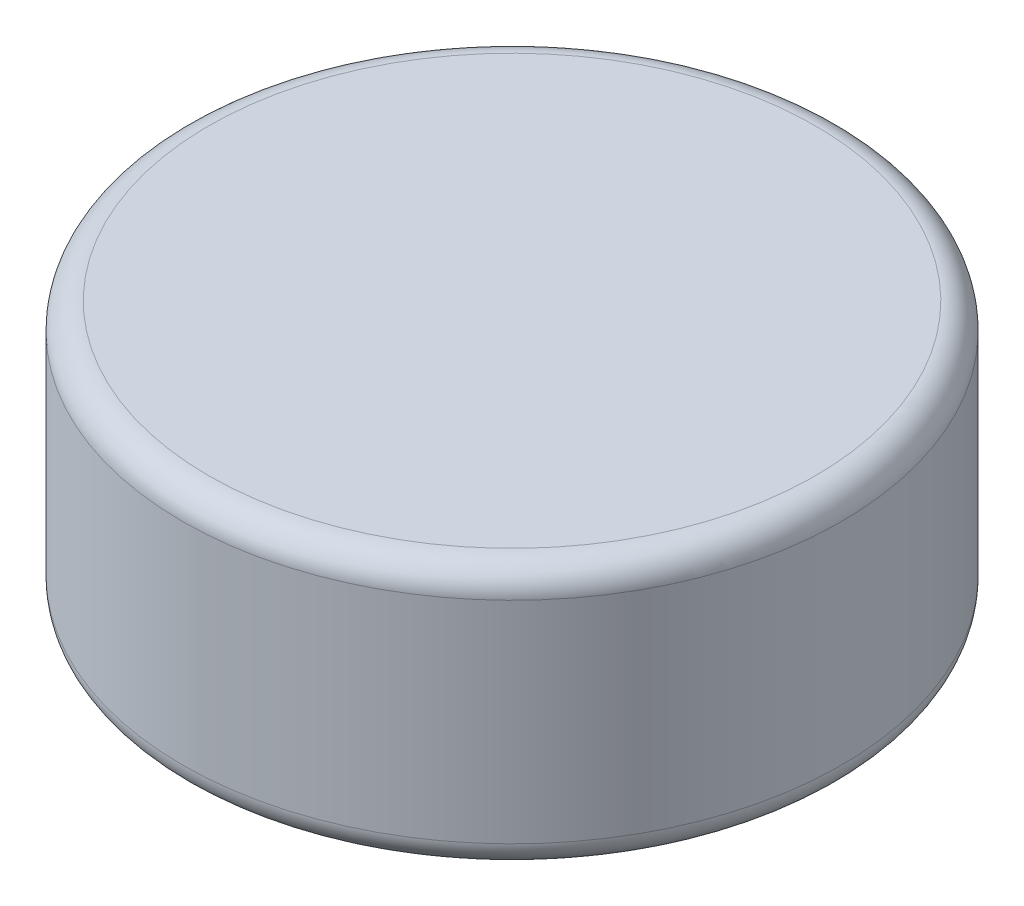
ISO-10303-21;
HEADER;
FILE_DESCRIPTION(('STEP AP214'),'2;1');
FILE_NAME('part.step','',(''),(''),'','','');
FILE_SCHEMA(('AUTOMOTIVE_DESIGN { 1 0 10303 214 1 1 1 1 }'));
ENDSEC;
DATA;
#1=APPLICATION_CONTEXT('core data for automotive mechanical design processes');
#2=APPLICATION_PROTOCOL_DEFINITION('international standard','automotive_design',2000,#1);
#3=PRODUCT_CONTEXT('',#1,'mechanical');
#4=PRODUCT('Part','Part','',(#3));
#5=PRODUCT_RELATED_PRODUCT_CATEGORY('part','',(#4));
#6=PRODUCT_DEFINITION_FORMATION('','',#4);
#7=PRODUCT_DEFINITION_CONTEXT('part definition',#1,'design');
#8=PRODUCT_DEFINITION('design','',#6,#7);
#9=PRODUCT_DEFINITION_SHAPE('','',#8);
#10=(LENGTH_UNIT() NAMED_UNIT(*) SI_UNIT(.MILLI.,.METRE.));
#11=(NAMED_UNIT(*) PLANE_ANGLE_UNIT() SI_UNIT($,.RADIAN.));
#12=(NAMED_UNIT(*) SI_UNIT($,.STERADIAN.) SOLID_ANGLE_UNIT());
#13=UNCERTAINTY_MEASURE_WITH_UNIT(LENGTH_MEASURE(1.E-05),#10,'distance_accuracy_value','');
#14=(GEOMETRIC_REPRESENTATION_CONTEXT(3) GLOBAL_UNCERTAINTY_ASSIGNED_CONTEXT((#13)) GLOBAL_UNIT_ASSIGNED_CONTEXT((#10,
#11,#12)) REPRESENTATION_CONTEXT('',''));
#15=CARTESIAN_POINT('',(0.,0.,0.));
#16=DIRECTION('',(0.,0.,1.));
#17=DIRECTION('',(1.,0.,0.));
#18=AXIS2_PLACEMENT_3D('',#15,#16,#17);
#19=CARTESIAN_POINT('',(0.,1.,0.));
#20=DIRECTION('',(0.,-1.,0.));
#21=DIRECTION('',(0.,0.,-1.));
#22=AXIS2_PLACEMENT_3D('',#19,#20,#21);
#23=CYLINDRICAL_SURFACE('',#22,2.5);
#24=CARTESIAN_POINT('',(0.,-0.8,0.));
#25=DIRECTION('',(0.,1.,0.));
#26=DIRECTION('',(0.,0.,1.));
#27=AXIS2_PLACEMENT_3D('',#24,#25,#26);
#28=CIRCLE('',#27,2.5);
#29=CARTESIAN_POINT('',(0.,-0.8,2.5));
#30=VERTEX_POINT('',#29);
#31=EDGE_CURVE('E48',#30,#30,#28,.T.);
#32=ORIENTED_EDGE('',*,*,#31,.T.);
#33=EDGE_LOOP('',(#32));
#34=FACE_BOUND('',#33,.T.);
#35=CARTESIAN_POINT('',(0.,0.8,0.));
#36=DIRECTION('',(0.,1.,0.));
#37=DIRECTION('',(0.,0.,1.));
#38=AXIS2_PLACEMENT_3D('',#35,#36,#37);
#39=CIRCLE('',#38,2.5);
#40=CARTESIAN_POINT('',(0.,0.8,2.5));
#41=VERTEX_POINT('',#40);
#42=EDGE_CURVE('E55',#41,#41,#39,.F.);
#43=ORIENTED_EDGE('',*,*,#42,.T.);
#44=EDGE_LOOP('',(#43));
#45=FACE_BOUND('',#44,.T.);
#46=ADVANCED_FACE('F40',(#34,#45),#23,.T.);
#47=CARTESIAN_POINT('',(0.,1.,0.));
#48=DIRECTION('',(0.,1.,0.));
#49=DIRECTION('',(0.,0.,1.));
#50=AXIS2_PLACEMENT_3D('',#47,#48,#49);
#51=PLANE('',#50);
#52=CARTESIAN_POINT('',(0.,1.,0.));
#53=DIRECTION('',(0.,1.,0.));
#54=DIRECTION('',(0.,0.,1.));
#55=AXIS2_PLACEMENT_3D('',#52,#53,#54);
#56=CIRCLE('',#55,2.3);
#57=CARTESIAN_POINT('',(0.,1.,2.3));
#58=VERTEX_POINT('',#57);
#59=EDGE_CURVE('E10',#58,#58,#56,.T.);
#60=ORIENTED_EDGE('',*,*,#59,.T.);
#61=EDGE_LOOP('',(#60));
#62=FACE_BOUND('',#61,.T.);
#63=ADVANCED_FACE('F68',(#62),#51,.T.);
#64=CARTESIAN_POINT('',(0.,-1.,0.));
#65=DIRECTION('',(0.,1.,0.));
#66=DIRECTION('',(0.,0.,1.));
#67=AXIS2_PLACEMENT_3D('',#64,#65,#66);
#68=PLANE('',#67);
#69=CARTESIAN_POINT('',(0.,-1.,0.));
#70=DIRECTION('',(0.,1.,0.));
#71=DIRECTION('',(0.,0.,1.));
#72=AXIS2_PLACEMENT_3D('',#69,#70,#71);
#73=CIRCLE('',#72,2.3);
#74=CARTESIAN_POINT('',(0.,-1.,2.3));
#75=VERTEX_POINT('',#74);
#76=EDGE_CURVE('E42',#75,#75,#73,.F.);
#77=ORIENTED_EDGE('',*,*,#76,.T.);
#78=EDGE_LOOP('',(#77));
#79=FACE_BOUND('',#78,.T.);
#80=ADVANCED_FACE('F61',(#79),#68,.F.);
#81=CARTESIAN_POINT('',(0.,-0.8,0.));
#82=DIRECTION('',(0.,1.,0.));
#83=DIRECTION('',(0.,0.,1.));
#84=AXIS2_PLACEMENT_3D('',#81,#82,#83);
#85=TOROIDAL_SURFACE('',#84,2.3,0.2);
#86=ORIENTED_EDGE('',*,*,#76,.F.);
#87=EDGE_LOOP('',(#86));
#88=FACE_BOUND('',#87,.T.);
#89=ORIENTED_EDGE('',*,*,#31,.F.);
#90=EDGE_LOOP('',(#89));
#91=FACE_BOUND('',#90,.T.);
#92=ADVANCED_FACE('F63',(#88,#91),#85,.T.);
#93=CARTESIAN_POINT('',(0.,0.8,0.));
#94=DIRECTION('',(0.,1.,0.));
#95=DIRECTION('',(0.,0.,1.));
#96=AXIS2_PLACEMENT_3D('',#93,#94,#95);
#97=TOROIDAL_SURFACE('',#96,2.3,0.2);
#98=ORIENTED_EDGE('',*,*,#42,.F.);
#99=EDGE_LOOP('',(#98));
#100=FACE_BOUND('',#99,.T.);
#101=ORIENTED_EDGE('',*,*,#59,.F.);
#102=EDGE_LOOP('',(#101));
#103=FACE_BOUND('',#102,.T.);
#104=ADVANCED_FACE('F39',(#100,#103),#97,.T.);
#105=CLOSED_SHELL('',(#46,#63,#80,#92,#104));
#106=MANIFOLD_SOLID_BREP('B2',#105);
#107=ADVANCED_BREP_SHAPE_REPRESENTATION('',(#18,#106),#14);
#108=SHAPE_DEFINITION_REPRESENTATION(#9,#107);
ENDSEC;
END-ISO-10303-21;
